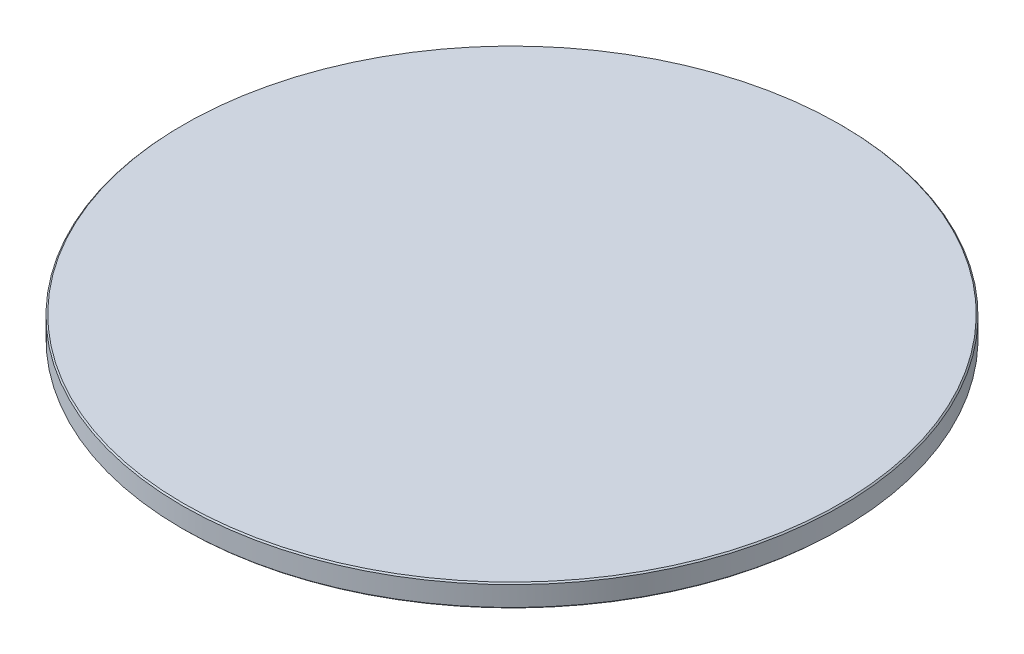
ISO-10303-21;
HEADER;
FILE_DESCRIPTION(('STEP AP214'),'2;1');
FILE_NAME('part.step','',(''),(''),'','','');
FILE_SCHEMA(('AUTOMOTIVE_DESIGN { 1 0 10303 214 1 1 1 1 }'));
ENDSEC;
DATA;
#1=APPLICATION_CONTEXT('core data for automotive mechanical design processes');
#2=APPLICATION_PROTOCOL_DEFINITION('international standard','automotive_design',2000,#1);
#3=PRODUCT_CONTEXT('',#1,'mechanical');
#4=PRODUCT('Part','Part','',(#3));
#5=PRODUCT_RELATED_PRODUCT_CATEGORY('part','',(#4));
#6=PRODUCT_DEFINITION_FORMATION('','',#4);
#7=PRODUCT_DEFINITION_CONTEXT('part definition',#1,'design');
#8=PRODUCT_DEFINITION('design','',#6,#7);
#9=PRODUCT_DEFINITION_SHAPE('','',#8);
#10=(LENGTH_UNIT() NAMED_UNIT(*) SI_UNIT(.MILLI.,.METRE.));
#11=(NAMED_UNIT(*) PLANE_ANGLE_UNIT() SI_UNIT($,.RADIAN.));
#12=(NAMED_UNIT(*) SI_UNIT($,.STERADIAN.) SOLID_ANGLE_UNIT());
#13=UNCERTAINTY_MEASURE_WITH_UNIT(LENGTH_MEASURE(1.E-05),#10,'distance_accuracy_value','');
#14=(GEOMETRIC_REPRESENTATION_CONTEXT(3) GLOBAL_UNCERTAINTY_ASSIGNED_CONTEXT((#13)) GLOBAL_UNIT_ASSIGNED_CONTEXT((#10,
#11,#12)) REPRESENTATION_CONTEXT('',''));
#15=CARTESIAN_POINT('',(0.,0.,0.));
#16=DIRECTION('',(0.,0.,1.));
#17=DIRECTION('',(1.,0.,0.));
#18=AXIS2_PLACEMENT_3D('',#15,#16,#17);
#19=CARTESIAN_POINT('',(0.,-0.1,0.));
#20=DIRECTION('',(0.,-1.,0.));
#21=DIRECTION('',(0.,0.,-1.));
#22=AXIS2_PLACEMENT_3D('',#19,#20,#21);
#23=CONICAL_SURFACE('',#22,25.75,0.785398163397445);
#24=CARTESIAN_POINT('',(0.,-0.1,0.));
#25=DIRECTION('',(0.,-1.,0.));
#26=DIRECTION('',(0.,0.,-1.));
#27=AXIS2_PLACEMENT_3D('',#24,#25,#26);
#28=CIRCLE('',#27,25.75);
#29=CARTESIAN_POINT('',(0.,-0.1,-25.75));
#30=VERTEX_POINT('',#29);
#31=EDGE_CURVE('E20',#30,#30,#28,.T.);
#32=ORIENTED_EDGE('',*,*,#31,.F.);
#33=EDGE_LOOP('',(#32));
#34=FACE_BOUND('',#33,.T.);
#35=CARTESIAN_POINT('',(0.,0.,0.));
#36=DIRECTION('',(0.,1.,0.));
#37=DIRECTION('',(0.,0.,-1.));
#38=AXIS2_PLACEMENT_3D('',#35,#36,#37);
#39=CIRCLE('',#38,25.65);
#40=CARTESIAN_POINT('',(0.,0.,-25.65));
#41=VERTEX_POINT('',#40);
#42=EDGE_CURVE('E11',#41,#41,#39,.T.);
#43=ORIENTED_EDGE('',*,*,#42,.F.);
#44=EDGE_LOOP('',(#43));
#45=FACE_BOUND('',#44,.T.);
#46=ADVANCED_FACE('F16',(#34,#45),#23,.T.);
#47=CARTESIAN_POINT('',(0.,-1.75,0.));
#48=DIRECTION('',(0.,1.,0.));
#49=DIRECTION('',(0.,0.,1.));
#50=AXIS2_PLACEMENT_3D('',#47,#48,#49);
#51=CONICAL_SURFACE('',#50,25.65,0.785398163397445);
#52=CARTESIAN_POINT('',(0.,-1.75,0.));
#53=DIRECTION('',(0.,-1.,0.));
#54=DIRECTION('',(0.,0.,-1.));
#55=AXIS2_PLACEMENT_3D('',#52,#53,#54);
#56=CIRCLE('',#55,25.65);
#57=CARTESIAN_POINT('',(0.,-1.75,-25.65));
#58=VERTEX_POINT('',#57);
#59=EDGE_CURVE('E27',#58,#58,#56,.T.);
#60=ORIENTED_EDGE('',*,*,#59,.F.);
#61=EDGE_LOOP('',(#60));
#62=FACE_BOUND('',#61,.T.);
#63=CARTESIAN_POINT('',(0.,-1.65,0.));
#64=DIRECTION('',(0.,1.,0.));
#65=DIRECTION('',(0.,0.,-1.));
#66=AXIS2_PLACEMENT_3D('',#63,#64,#65);
#67=CIRCLE('',#66,25.75);
#68=CARTESIAN_POINT('',(0.,-1.65,-25.75));
#69=VERTEX_POINT('',#68);
#70=EDGE_CURVE('E52',#69,#69,#67,.T.);
#71=ORIENTED_EDGE('',*,*,#70,.F.);
#72=EDGE_LOOP('',(#71));
#73=FACE_BOUND('',#72,.T.);
#74=ADVANCED_FACE('F61',(#62,#73),#51,.T.);
#75=CARTESIAN_POINT('',(0.,0.,0.));
#76=DIRECTION('',(0.,-1.,0.));
#77=DIRECTION('',(0.,0.,-1.));
#78=AXIS2_PLACEMENT_3D('',#75,#76,#77);
#79=PLANE('',#78);
#80=ORIENTED_EDGE('',*,*,#42,.T.);
#81=EDGE_LOOP('',(#80));
#82=FACE_BOUND('',#81,.T.);
#83=ADVANCED_FACE('F63',(#82),#79,.F.);
#84=CARTESIAN_POINT('',(0.,-1.75,0.));
#85=DIRECTION('',(0.,-1.,0.));
#86=DIRECTION('',(0.,0.,-1.));
#87=AXIS2_PLACEMENT_3D('',#84,#85,#86);
#88=PLANE('',#87);
#89=ORIENTED_EDGE('',*,*,#59,.T.);
#90=EDGE_LOOP('',(#89));
#91=FACE_BOUND('',#90,.T.);
#92=ADVANCED_FACE('F18',(#91),#88,.T.);
#93=CARTESIAN_POINT('',(0.,-1.75,0.));
#94=DIRECTION('',(0.,1.,0.));
#95=DIRECTION('',(0.,0.,1.));
#96=AXIS2_PLACEMENT_3D('',#93,#94,#95);
#97=CYLINDRICAL_SURFACE('',#96,25.75);
#98=ORIENTED_EDGE('',*,*,#31,.T.);
#99=EDGE_LOOP('',(#98));
#100=FACE_BOUND('',#99,.T.);
#101=ORIENTED_EDGE('',*,*,#70,.T.);
#102=EDGE_LOOP('',(#101));
#103=FACE_BOUND('',#102,.T.);
#104=ADVANCED_FACE('F48',(#100,#103),#97,.T.);
#105=CLOSED_SHELL('',(#46,#74,#83,#92,#104));
#106=MANIFOLD_SOLID_BREP('B1',#105);
#107=ADVANCED_BREP_SHAPE_REPRESENTATION('',(#18,#106),#14);
#108=SHAPE_DEFINITION_REPRESENTATION(#9,#107);
ENDSEC;
END-ISO-10303-21;
